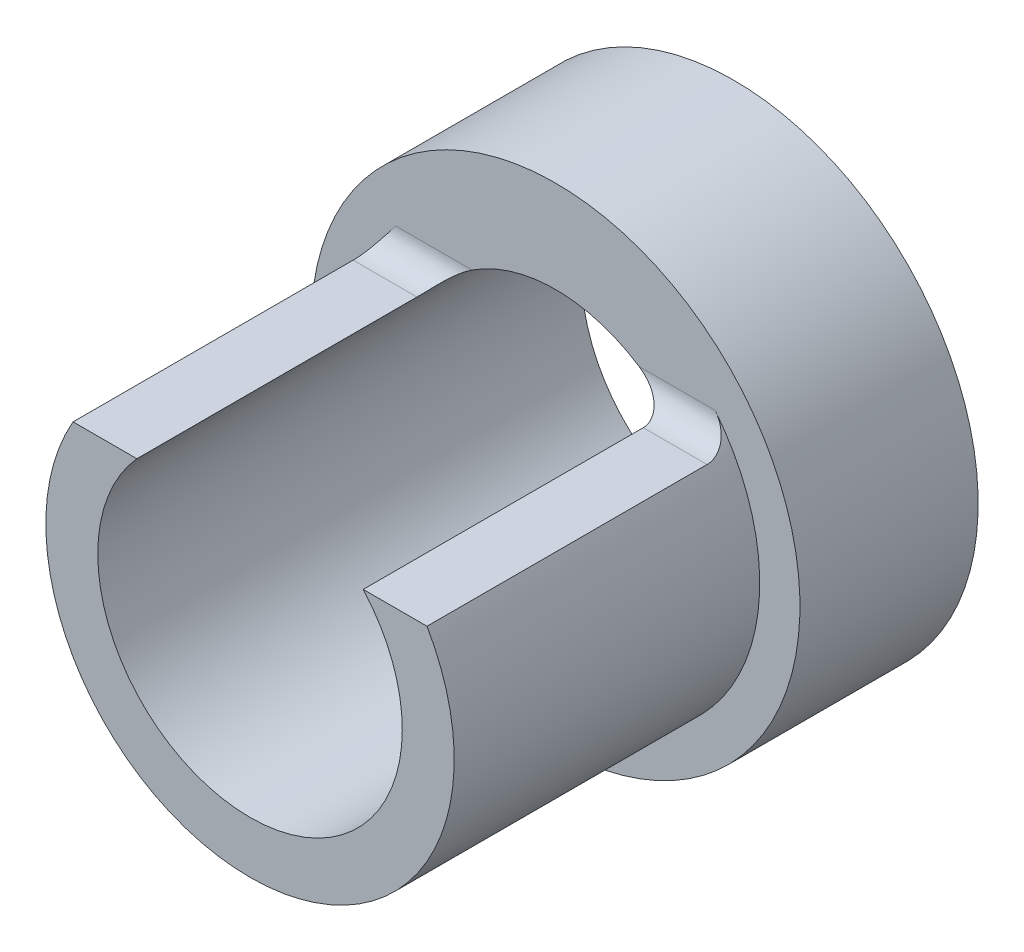
ISO-10303-21;
HEADER;
FILE_DESCRIPTION(('STEP AP214'),'2;1');
FILE_NAME('part.step','',(''),(''),'','','');
FILE_SCHEMA(('AUTOMOTIVE_DESIGN { 1 0 10303 214 1 1 1 1 }'));
ENDSEC;
DATA;
#1=APPLICATION_CONTEXT('core data for automotive mechanical design processes');
#2=APPLICATION_PROTOCOL_DEFINITION('international standard','automotive_design',2000,#1);
#3=PRODUCT_CONTEXT('',#1,'mechanical');
#4=PRODUCT('Part','Part','',(#3));
#5=PRODUCT_RELATED_PRODUCT_CATEGORY('part','',(#4));
#6=PRODUCT_DEFINITION_FORMATION('','',#4);
#7=PRODUCT_DEFINITION_CONTEXT('part definition',#1,'design');
#8=PRODUCT_DEFINITION('design','',#6,#7);
#9=PRODUCT_DEFINITION_SHAPE('','',#8);
#10=(LENGTH_UNIT() NAMED_UNIT(*) SI_UNIT(.MILLI.,.METRE.));
#11=(NAMED_UNIT(*) PLANE_ANGLE_UNIT() SI_UNIT($,.RADIAN.));
#12=(NAMED_UNIT(*) SI_UNIT($,.STERADIAN.) SOLID_ANGLE_UNIT());
#13=UNCERTAINTY_MEASURE_WITH_UNIT(LENGTH_MEASURE(1.E-05),#10,'distance_accuracy_value','');
#14=(GEOMETRIC_REPRESENTATION_CONTEXT(3) GLOBAL_UNCERTAINTY_ASSIGNED_CONTEXT((#13)) GLOBAL_UNIT_ASSIGNED_CONTEXT((#10,
#11,#12)) REPRESENTATION_CONTEXT('',''));
#15=CARTESIAN_POINT('',(0.,0.,0.));
#16=DIRECTION('',(0.,0.,1.));
#17=DIRECTION('',(1.,0.,0.));
#18=AXIS2_PLACEMENT_3D('',#15,#16,#17);
#19=CARTESIAN_POINT('',(0.,0.,3.));
#20=DIRECTION('',(0.,0.,-1.));
#21=DIRECTION('',(-1.,0.,0.));
#22=AXIS2_PLACEMENT_3D('',#19,#20,#21);
#23=CYLINDRICAL_SURFACE('',#22,2.005);
#24=CARTESIAN_POINT('',(0.,0.,0.));
#25=DIRECTION('',(0.,0.,1.));
#26=DIRECTION('',(1.,0.,0.));
#27=AXIS2_PLACEMENT_3D('',#24,#25,#26);
#28=CIRCLE('',#27,2.005);
#29=CARTESIAN_POINT('',(-1.56764951440046,1.25,0.));
#30=VERTEX_POINT('',#29);
#31=CARTESIAN_POINT('',(1.56764951440046,1.25,0.));
#32=VERTEX_POINT('',#31);
#33=EDGE_CURVE('E109',#30,#32,#28,.T.);
#34=ORIENTED_EDGE('',*,*,#33,.T.);
#35=CARTESIAN_POINT('',(1.56764951440046,1.25,0.));
#36=CARTESIAN_POINT('',(1.58083659219766,1.23348905936665,-5.56233274766714E-06));
#37=CARTESIAN_POINT('',(1.5937864895774,1.21668619907632,0.00163957177487354));
#38=CARTESIAN_POINT('',(1.61888608203988,1.18307102792846,0.00851208941660158));
#39=CARTESIAN_POINT('',(1.63103064127472,1.16625923908178,0.0137604158050403));
#40=CARTESIAN_POINT('',(1.65137140531759,1.1372067951425,0.0264660442388101));
#41=CARTESIAN_POINT('',(1.65983136159149,1.12480782586135,0.0331322579629933));
#42=CARTESIAN_POINT('',(1.67576957022082,1.10092046616889,0.0488067030720315));
#43=CARTESIAN_POINT('',(1.68324995638436,1.08943011889599,0.0578097120711143));
#44=CARTESIAN_POINT('',(1.69708430795968,1.06775329522893,0.0782166585485899));
#45=CARTESIAN_POINT('',(1.70342797779078,1.05757894788894,0.0896406767352822));
#46=CARTESIAN_POINT('',(1.71467486156593,1.0392455514253,0.114640680039879));
#47=CARTESIAN_POINT('',(1.71957833279418,1.03108614238464,0.128216280120606));
#48=CARTESIAN_POINT('',(1.72715919527867,1.01832878724597,0.155039717159965));
#49=CARTESIAN_POINT('',(1.73005244573125,1.0133916878615,0.168066067838673));
#50=CARTESIAN_POINT('',(1.7345137133511,1.00573716763573,0.194956023743968));
#51=CARTESIAN_POINT('',(1.73608499901353,1.0030142728403,0.208817472660652));
#52=CARTESIAN_POINT('',(1.73725334342521,1.00098748475811,0.22733784079116));
#53=CARTESIAN_POINT('',(1.73746661756384,1.00061720683141,0.231863234261993));
#54=CARTESIAN_POINT('',(1.73775068844592,1.00012382505681,0.240924946388283));
#55=CARTESIAN_POINT('',(1.73782170398249,1.0000003416407,0.245461237506915));
#56=CARTESIAN_POINT('',(1.73782191262519,0.999999999999992,0.249999999999994));
#57=B_SPLINE_CURVE_WITH_KNOTS('',3,(#35,#36,#37,#38,#39,#40,#41,#42,#43,#44,#45,#46,#47,#48,#49,
#50,#51,#52,#53,#54,#55,#56),.UNSPECIFIED.,.F.,.F.,(4,2,2,2,2,2,2,2,2,2,4),(0.,
0.0634564730028024,0.127284932124926,0.17635856403367,0.225323454171673,0.27471159193456,
0.324090901382903,0.366538775683856,0.408881388606126,0.422511497328162,0.436120626858198),.UNSPECIFIED.);
#58=CARTESIAN_POINT('',(1.73782191262511,1.,0.25));
#59=VERTEX_POINT('',#58);
#60=EDGE_CURVE('E11',#32,#59,#57,.T.);
#61=ORIENTED_EDGE('',*,*,#60,.T.);
#62=DIRECTION('',(0.,0.,-1.));
#63=VECTOR('',#62,1.);
#64=CARTESIAN_POINT('',(1.73782191262511,1.,3.));
#65=LINE('',#64,#63);
#66=CARTESIAN_POINT('',(1.73782191262511,1.,3.));
#67=VERTEX_POINT('',#66);
#68=EDGE_CURVE('E95',#67,#59,#65,.T.);
#69=ORIENTED_EDGE('',*,*,#68,.F.);
#70=CARTESIAN_POINT('',(0.,0.,3.));
#71=DIRECTION('',(0.,0.,1.));
#72=DIRECTION('',(1.,0.,0.));
#73=AXIS2_PLACEMENT_3D('',#70,#71,#72);
#74=CIRCLE('',#73,2.005);
#75=CARTESIAN_POINT('',(-1.73782191262511,1.,3.));
#76=VERTEX_POINT('',#75);
#77=EDGE_CURVE('E101',#76,#67,#74,.T.);
#78=ORIENTED_EDGE('',*,*,#77,.F.);
#79=DIRECTION('',(0.,0.,-1.));
#80=VECTOR('',#79,1.);
#81=CARTESIAN_POINT('',(-1.73782191262511,1.,3.));
#82=LINE('',#81,#80);
#83=CARTESIAN_POINT('',(-1.73782191262511,1.,0.25));
#84=VERTEX_POINT('',#83);
#85=EDGE_CURVE('E182',#76,#84,#82,.T.);
#86=ORIENTED_EDGE('',*,*,#85,.T.);
#87=CARTESIAN_POINT('',(-1.73782191262511,1.,0.25));
#88=CARTESIAN_POINT('',(-1.73782753915186,0.999983303020557,0.237378702954193));
#89=CARTESIAN_POINT('',(-1.73727257366862,1.00095463845805,0.224768929895881));
#90=CARTESIAN_POINT('',(-1.73508710029291,1.00474181614992,0.199971358737314));
#91=CARTESIAN_POINT('',(-1.73346057066254,1.00755083559679,0.1877821746501));
#92=CARTESIAN_POINT('',(-1.72917812348534,1.01488167873659,0.164132390651987));
#93=CARTESIAN_POINT('',(-1.72652273441389,1.0194026230694,0.152671420205136));
#94=CARTESIAN_POINT('',(-1.72025611618168,1.02994253119884,0.130740930011576));
#95=CARTESIAN_POINT('',(-1.71664434394887,1.0359623459969,0.120271978172868));
#96=CARTESIAN_POINT('',(-1.70839037218071,1.04952015692584,0.100129226446443));
#97=CARTESIAN_POINT('',(-1.70371208331699,1.0571101580495,0.0905054308728532));
#98=CARTESIAN_POINT('',(-1.6935325846857,1.07334253228507,0.0726937585355726));
#99=CARTESIAN_POINT('',(-1.68803112710147,1.08198522216491,0.0645063158070118));
#100=CARTESIAN_POINT('',(-1.67561091197476,1.10113498887139,0.048726050153682));
#101=CARTESIAN_POINT('',(-1.66860119276787,1.11174107795572,0.0413255099889286));
#102=CARTESIAN_POINT('',(-1.65384885835769,1.13357085099626,0.028402498263155));
#103=CARTESIAN_POINT('',(-1.64610564090111,1.14479503923364,0.0228815873962318));
#104=CARTESIAN_POINT('',(-1.62869724053303,1.16945891648052,0.0128958533218357));
#105=CARTESIAN_POINT('',(-1.61892661751227,1.18295654068005,0.00875951340030943));
#106=CARTESIAN_POINT('',(-1.59880787259738,1.21000914057366,0.00283117603363424));
#107=CARTESIAN_POINT('',(-1.5884602377243,1.22356405923768,0.00103723183075072));
#108=CARTESIAN_POINT('',(-1.57451580704922,1.2413525088201,0.000111789775028347));
#109=CARTESIAN_POINT('',(-1.57109098691034,1.24568441427877,4.29288269100033E-08));
#110=CARTESIAN_POINT('',(-1.56764951440046,1.25,0.));
#111=B_SPLINE_CURVE_WITH_KNOTS('',3,(#87,#88,#89,#90,#91,#92,#93,#94,#95,#96,#97,#98,#99,#100,
#101,#102,#103,#104,#105,#106,#107,#108,#109,#110),.UNSPECIFIED.,.F.,.F.,(4,2,2,2,2,2,2,2,2,2,2,
4),(0.,0.0377963970474746,0.0754532569784148,0.113090799987459,0.150749761079221,
0.18994829024943,0.229158644050904,0.273120470103954,0.317118710028304,0.368436462901381,
0.419711538546883,0.436275700704751),.UNSPECIFIED.);
#112=EDGE_CURVE('E126',#84,#30,#111,.T.);
#113=ORIENTED_EDGE('',*,*,#112,.T.);
#114=EDGE_LOOP('',(#34,#61,#69,#78,#86,#113));
#115=FACE_BOUND('',#114,.T.);
#116=ADVANCED_FACE('F35',(#115),#23,.T.);
#117=CARTESIAN_POINT('',(1.11131678651949,1.,3.));
#118=DIRECTION('',(0.,-1.,0.));
#119=DIRECTION('',(0.,0.,-1.));
#120=AXIS2_PLACEMENT_3D('',#117,#118,#119);
#121=PLANE('',#120);
#122=ORIENTED_EDGE('',*,*,#68,.T.);
#123=DIRECTION('',(-1.,0.,0.));
#124=VECTOR('',#123,1.);
#125=CARTESIAN_POINT('',(1.11131678651949,1.,0.25));
#126=LINE('',#125,#124);
#127=CARTESIAN_POINT('',(1.11131678651949,1.,0.25));
#128=VERTEX_POINT('',#127);
#129=EDGE_CURVE('E124',#59,#128,#126,.T.);
#130=ORIENTED_EDGE('',*,*,#129,.T.);
#131=DIRECTION('',(0.,0.,-1.));
#132=VECTOR('',#131,1.);
#133=CARTESIAN_POINT('',(1.11131678651949,1.,3.));
#134=LINE('',#133,#132);
#135=CARTESIAN_POINT('',(1.11131678651949,1.,3.));
#136=VERTEX_POINT('',#135);
#137=EDGE_CURVE('E97',#136,#128,#134,.T.);
#138=ORIENTED_EDGE('',*,*,#137,.F.);
#139=DIRECTION('',(-1.,0.,0.));
#140=VECTOR('',#139,1.);
#141=CARTESIAN_POINT('',(1.11131678651949,1.,3.));
#142=LINE('',#141,#140);
#143=EDGE_CURVE('E92',#67,#136,#142,.T.);
#144=ORIENTED_EDGE('',*,*,#143,.F.);
#145=EDGE_LOOP('',(#122,#130,#138,#144));
#146=FACE_BOUND('',#145,.T.);
#147=ADVANCED_FACE('F94',(#146),#121,.F.);
#148=CARTESIAN_POINT('',(0.,0.,3.));
#149=DIRECTION('',(0.,0.,-1.));
#150=DIRECTION('',(-1.,0.,0.));
#151=AXIS2_PLACEMENT_3D('',#148,#149,#150);
#152=CYLINDRICAL_SURFACE('',#151,1.495);
#153=ORIENTED_EDGE('',*,*,#137,.T.);
#154=CARTESIAN_POINT('',(1.11131678651949,1.,0.25));
#155=CARTESIAN_POINT('',(1.11132815288724,0.999981555239978,0.23866446223566));
#156=CARTESIAN_POINT('',(1.11062419633675,1.00076975668263,0.227347631742487));
#157=CARTESIAN_POINT('',(1.10788184230027,1.00380773448563,0.20514995616144));
#158=CARTESIAN_POINT('',(1.10585205137618,1.00604808361563,0.194266776228904));
#159=CARTESIAN_POINT('',(1.10055626142728,1.01183753273282,0.173197497261634));
#160=CARTESIAN_POINT('',(1.09729221398699,1.01538456638651,0.163010327576745));
#161=CARTESIAN_POINT('',(1.08966492733144,1.02356576847835,0.143513041387072));
#162=CARTESIAN_POINT('',(1.08529994904832,1.02820165610301,0.134204344820899));
#163=CARTESIAN_POINT('',(1.07413689000823,1.03987396681944,0.113900850835954));
#164=CARTESIAN_POINT('',(1.06700309747612,1.04721068789686,0.103263382554402));
#165=CARTESIAN_POINT('',(1.05144662888831,1.06282977576547,0.0837964296750195));
#166=CARTESIAN_POINT('',(1.0430226626495,1.07111308702524,0.0749687758023992));
#167=CARTESIAN_POINT('',(1.02177038966109,1.09146650093776,0.0560228070333049));
#168=CARTESIAN_POINT('',(1.00848354165139,1.10378112325526,0.0466851882554225));
#169=CARTESIAN_POINT('',(0.980489087375989,1.12872597002718,0.0308842838001305));
#170=CARTESIAN_POINT('',(0.965774782467229,1.14135745368827,0.024435435194484));
#171=CARTESIAN_POINT('',(0.930056651407412,1.17077731082136,0.0121747252307072));
#172=CARTESIAN_POINT('',(0.908648479453982,1.18747969127753,0.00736868503836815));
#173=CARTESIAN_POINT('',(0.864944008057883,1.21969067555249,0.00132397462381903));
#174=CARTESIAN_POINT('',(0.842665558575446,1.23521329632264,3.3523074376195E-05));
#175=CARTESIAN_POINT('',(0.820076215970199,1.25,0.));
#176=B_SPLINE_CURVE_WITH_KNOTS('',3,(#154,#155,#156,#157,#158,#159,#160,#161,#162,#163,#164,
#165,#166,#167,#168,#169,#170,#171,#172,#173,#174,#175),.UNSPECIFIED.,.F.,.F.,(4,2,2,2,2,2,2,2,
2,2,4),(0.,0.033927849797253,0.0676376192385996,0.101294308770925,0.135004500222187,
0.179043838858971,0.22312750822796,0.283933928575613,0.345040937500498,0.427450929315108,
0.508640363798535),.UNSPECIFIED.);
#177=CARTESIAN_POINT('',(0.820076215970199,1.25,0.));
#178=VERTEX_POINT('',#177);
#179=EDGE_CURVE('E49',#128,#178,#176,.T.);
#180=ORIENTED_EDGE('',*,*,#179,.T.);
#181=CARTESIAN_POINT('',(0.,0.,0.));
#182=DIRECTION('',(0.,0.,-1.));
#183=DIRECTION('',(-1.,0.,0.));
#184=AXIS2_PLACEMENT_3D('',#181,#182,#183);
#185=CIRCLE('',#184,1.495);
#186=CARTESIAN_POINT('',(-0.820076215970199,1.25,0.));
#187=VERTEX_POINT('',#186);
#188=EDGE_CURVE('E178',#187,#178,#185,.T.);
#189=ORIENTED_EDGE('',*,*,#188,.F.);
#190=CARTESIAN_POINT('',(-0.820076215970199,1.25,0.));
#191=CARTESIAN_POINT('',(-0.834456691670775,1.2405691061626,5.78042097761777E-06));
#192=CARTESIAN_POINT('',(-0.848684620899537,1.23087633152429,0.000534757350304561));
#193=CARTESIAN_POINT('',(-0.876802254768637,1.211007168066,0.00285424346387778));
#194=CARTESIAN_POINT('',(-0.890689796037538,1.20082851092679,0.0046513496088506));
#195=CARTESIAN_POINT('',(-0.918156614299433,1.17996437138647,0.0097668506422742));
#196=CARTESIAN_POINT('',(-0.93172751003334,1.16927341133714,0.0131089190169067));
#197=CARTESIAN_POINT('',(-0.958129840655685,1.14773742128169,0.0215793946669696));
#198=CARTESIAN_POINT('',(-0.970962991288435,1.13689282848545,0.0267034441094122));
#199=CARTESIAN_POINT('',(-0.994872748770529,1.11601440958989,0.0386175338278232));
#200=CARTESIAN_POINT('',(-1.00600941005406,1.10597457131808,0.0452743256947426));
#201=CARTESIAN_POINT('',(-1.02717116651822,1.08634765721616,0.0606008288203009));
#202=CARTESIAN_POINT('',(-1.0372008303899,1.0767588219935,0.0692617718880984));
#203=CARTESIAN_POINT('',(-1.05447293429983,1.05982828621502,0.0873215309244562));
#204=CARTESIAN_POINT('',(-1.0619080609435,1.05236446443578,0.0964191042271241));
#205=CARTESIAN_POINT('',(-1.0755113496896,1.03845792481646,0.116224525891146));
#206=CARTESIAN_POINT('',(-1.08168004800804,1.03201477508056,0.12693168939868));
#207=CARTESIAN_POINT('',(-1.0915033559248,1.02161023573523,0.147780748387642));
#208=CARTESIAN_POINT('',(-1.09540993292086,1.0174112918117,0.157684942370655));
#209=CARTESIAN_POINT('',(-1.10201471679356,1.01025360035396,0.178304242806908));
#210=CARTESIAN_POINT('',(-1.10471494825867,1.00729277544503,0.189017955051572));
#211=CARTESIAN_POINT('',(-1.1082567645908,1.0033928425089,0.208123227317132));
#212=CARTESIAN_POINT('',(-1.10939904255723,1.00212826040003,0.216394438365003));
#213=CARTESIAN_POINT('',(-1.11093139327405,1.0004282934852,0.233107827634207));
#214=CARTESIAN_POINT('',(-1.11131984045386,0.999994700660359,0.241550335746463));
#215=CARTESIAN_POINT('',(-1.11131678651949,1.,0.25));
#216=B_SPLINE_CURVE_WITH_KNOTS('',3,(#190,#191,#192,#193,#194,#195,#196,#197,#198,#199,#200,
#201,#202,#203,#204,#205,#206,#207,#208,#209,#210,#211,#212,#213,#214,#215),.UNSPECIFIED.,.F.,
.F.,(4,2,2,2,2,2,2,2,2,2,2,2,4),(0.,0.0516051580157572,0.103480770453772,0.15617905535615,
0.208749362510365,0.25782821964739,0.306696285367889,0.34829747980854,0.389881023472491,
0.42407457569854,0.458210523905492,0.483472579869954,0.508789050993669),.UNSPECIFIED.);
#217=CARTESIAN_POINT('',(-1.11131678651949,1.,0.25));
#218=VERTEX_POINT('',#217);
#219=EDGE_CURVE('E133',#187,#218,#216,.T.);
#220=ORIENTED_EDGE('',*,*,#219,.T.);
#221=DIRECTION('',(0.,0.,-1.));
#222=VECTOR('',#221,1.);
#223=CARTESIAN_POINT('',(-1.11131678651949,1.,3.));
#224=LINE('',#223,#222);
#225=CARTESIAN_POINT('',(-1.11131678651949,1.,3.));
#226=VERTEX_POINT('',#225);
#227=EDGE_CURVE('E116',#226,#218,#224,.T.);
#228=ORIENTED_EDGE('',*,*,#227,.F.);
#229=CARTESIAN_POINT('',(0.,0.,3.));
#230=DIRECTION('',(0.,0.,-1.));
#231=DIRECTION('',(1.,0.,0.));
#232=AXIS2_PLACEMENT_3D('',#229,#230,#231);
#233=CIRCLE('',#232,1.495);
#234=EDGE_CURVE('E100',#136,#226,#233,.T.);
#235=ORIENTED_EDGE('',*,*,#234,.F.);
#236=EDGE_LOOP('',(#153,#180,#189,#220,#228,#235));
#237=FACE_BOUND('',#236,.T.);
#238=CARTESIAN_POINT('',(0.,0.,-1.75));
#239=DIRECTION('',(0.,0.,-1.));
#240=DIRECTION('',(-1.,0.,0.));
#241=AXIS2_PLACEMENT_3D('',#238,#239,#240);
#242=CIRCLE('',#241,1.495);
#243=CARTESIAN_POINT('',(-1.495,0.,-1.75));
#244=VERTEX_POINT('',#243);
#245=EDGE_CURVE('E192',#244,#244,#242,.T.);
#246=ORIENTED_EDGE('',*,*,#245,.T.);
#247=EDGE_LOOP('',(#246));
#248=FACE_BOUND('',#247,.T.);
#249=ADVANCED_FACE('F159',(#237,#248),#152,.F.);
#250=CARTESIAN_POINT('',(-1.73782191262511,1.,3.));
#251=DIRECTION('',(0.,-1.,0.));
#252=DIRECTION('',(0.,0.,-1.));
#253=AXIS2_PLACEMENT_3D('',#250,#251,#252);
#254=PLANE('',#253);
#255=ORIENTED_EDGE('',*,*,#227,.T.);
#256=DIRECTION('',(-1.,0.,0.));
#257=VECTOR('',#256,1.);
#258=CARTESIAN_POINT('',(-1.73782191262511,1.,0.25));
#259=LINE('',#258,#257);
#260=EDGE_CURVE('E111',#218,#84,#259,.T.);
#261=ORIENTED_EDGE('',*,*,#260,.T.);
#262=ORIENTED_EDGE('',*,*,#85,.F.);
#263=DIRECTION('',(-1.,0.,0.));
#264=VECTOR('',#263,1.);
#265=CARTESIAN_POINT('',(-1.73782191262511,1.,3.));
#266=LINE('',#265,#264);
#267=EDGE_CURVE('E106',#226,#76,#266,.T.);
#268=ORIENTED_EDGE('',*,*,#267,.F.);
#269=EDGE_LOOP('',(#255,#261,#262,#268));
#270=FACE_BOUND('',#269,.T.);
#271=ADVANCED_FACE('F163',(#270),#254,.F.);
#272=CARTESIAN_POINT('',(0.,0.,3.));
#273=DIRECTION('',(0.,0.,1.));
#274=DIRECTION('',(1.,0.,0.));
#275=AXIS2_PLACEMENT_3D('',#272,#273,#274);
#276=PLANE('',#275);
#277=ORIENTED_EDGE('',*,*,#77,.T.);
#278=ORIENTED_EDGE('',*,*,#143,.T.);
#279=ORIENTED_EDGE('',*,*,#234,.T.);
#280=ORIENTED_EDGE('',*,*,#267,.T.);
#281=EDGE_LOOP('',(#277,#278,#279,#280));
#282=FACE_BOUND('',#281,.T.);
#283=ADVANCED_FACE('F104',(#282),#276,.T.);
#284=CARTESIAN_POINT('',(0.,0.,-1.75));
#285=DIRECTION('',(0.,0.,-1.));
#286=DIRECTION('',(-1.,0.,0.));
#287=AXIS2_PLACEMENT_3D('',#284,#285,#286);
#288=PLANE('',#287);
#289=CARTESIAN_POINT('',(0.,0.,-1.75));
#290=DIRECTION('',(0.,0.,-1.));
#291=DIRECTION('',(-1.,0.,0.));
#292=AXIS2_PLACEMENT_3D('',#289,#290,#291);
#293=CIRCLE('',#292,2.4);
#294=CARTESIAN_POINT('',(-2.4,0.,-1.75));
#295=VERTEX_POINT('',#294);
#296=EDGE_CURVE('E186',#295,#295,#293,.T.);
#297=ORIENTED_EDGE('',*,*,#296,.T.);
#298=EDGE_LOOP('',(#297));
#299=FACE_BOUND('',#298,.T.);
#300=ORIENTED_EDGE('',*,*,#245,.F.);
#301=EDGE_LOOP('',(#300));
#302=FACE_BOUND('',#301,.T.);
#303=ADVANCED_FACE('F199',(#299,#302),#288,.T.);
#304=CARTESIAN_POINT('',(0.,0.,0.));
#305=DIRECTION('',(0.,0.,-1.));
#306=DIRECTION('',(-1.,0.,0.));
#307=AXIS2_PLACEMENT_3D('',#304,#305,#306);
#308=PLANE('',#307);
#309=ORIENTED_EDGE('',*,*,#33,.F.);
#310=DIRECTION('',(-1.,0.,0.));
#311=VECTOR('',#310,1.);
#312=CARTESIAN_POINT('',(-1.11131678651949,1.25,0.));
#313=LINE('',#312,#311);
#314=EDGE_CURVE('E122',#30,#187,#313,.F.);
#315=ORIENTED_EDGE('',*,*,#314,.T.);
#316=ORIENTED_EDGE('',*,*,#188,.T.);
#317=DIRECTION('',(-1.,0.,0.));
#318=VECTOR('',#317,1.);
#319=CARTESIAN_POINT('',(1.73782191262511,1.25,0.));
#320=LINE('',#319,#318);
#321=EDGE_CURVE('E114',#178,#32,#320,.F.);
#322=ORIENTED_EDGE('',*,*,#321,.T.);
#323=EDGE_LOOP('',(#309,#315,#316,#322));
#324=FACE_BOUND('',#323,.T.);
#325=CARTESIAN_POINT('',(0.,0.,0.));
#326=DIRECTION('',(0.,0.,-1.));
#327=DIRECTION('',(-1.,0.,0.));
#328=AXIS2_PLACEMENT_3D('',#325,#326,#327);
#329=CIRCLE('',#328,2.4);
#330=CARTESIAN_POINT('',(-2.4,0.,0.));
#331=VERTEX_POINT('',#330);
#332=EDGE_CURVE('E189',#331,#331,#329,.T.);
#333=ORIENTED_EDGE('',*,*,#332,.F.);
#334=EDGE_LOOP('',(#333));
#335=FACE_BOUND('',#334,.T.);
#336=ADVANCED_FACE('F151',(#324,#335),#308,.F.);
#337=CARTESIAN_POINT('',(0.,0.,-1.75));
#338=DIRECTION('',(0.,0.,1.));
#339=DIRECTION('',(1.,0.,0.));
#340=AXIS2_PLACEMENT_3D('',#337,#338,#339);
#341=CYLINDRICAL_SURFACE('',#340,2.4);
#342=ORIENTED_EDGE('',*,*,#296,.F.);
#343=EDGE_LOOP('',(#342));
#344=FACE_BOUND('',#343,.T.);
#345=ORIENTED_EDGE('',*,*,#332,.T.);
#346=EDGE_LOOP('',(#345));
#347=FACE_BOUND('',#346,.T.);
#348=ADVANCED_FACE('F144',(#344,#347),#341,.T.);
#349=CARTESIAN_POINT('',(-1.73782191262511,1.25,0.25));
#350=DIRECTION('',(1.,0.,0.));
#351=DIRECTION('',(0.,0.,-1.));
#352=AXIS2_PLACEMENT_3D('',#349,#350,#351);
#353=CYLINDRICAL_SURFACE('',#352,0.25);
#354=ORIENTED_EDGE('',*,*,#219,.F.);
#355=ORIENTED_EDGE('',*,*,#314,.F.);
#356=ORIENTED_EDGE('',*,*,#112,.F.);
#357=ORIENTED_EDGE('',*,*,#260,.F.);
#358=EDGE_LOOP('',(#354,#355,#356,#357));
#359=FACE_BOUND('',#358,.T.);
#360=ADVANCED_FACE('F141',(#359),#353,.F.);
#361=CARTESIAN_POINT('',(1.11131678651949,1.25,0.25));
#362=DIRECTION('',(1.,0.,0.));
#363=DIRECTION('',(0.,0.,-1.));
#364=AXIS2_PLACEMENT_3D('',#361,#362,#363);
#365=CYLINDRICAL_SURFACE('',#364,0.25);
#366=ORIENTED_EDGE('',*,*,#60,.F.);
#367=ORIENTED_EDGE('',*,*,#321,.F.);
#368=ORIENTED_EDGE('',*,*,#179,.F.);
#369=ORIENTED_EDGE('',*,*,#129,.F.);
#370=EDGE_LOOP('',(#366,#367,#368,#369));
#371=FACE_BOUND('',#370,.T.);
#372=ADVANCED_FACE('F37',(#371),#365,.F.);
#373=CLOSED_SHELL('',(#116,#147,#249,#271,#283,#303,#336,#348,#360,#372));
#374=MANIFOLD_SOLID_BREP('B2',#373);
#375=ADVANCED_BREP_SHAPE_REPRESENTATION('',(#18,#374),#14);
#376=SHAPE_DEFINITION_REPRESENTATION(#9,#375);
ENDSEC;
END-ISO-10303-21;
